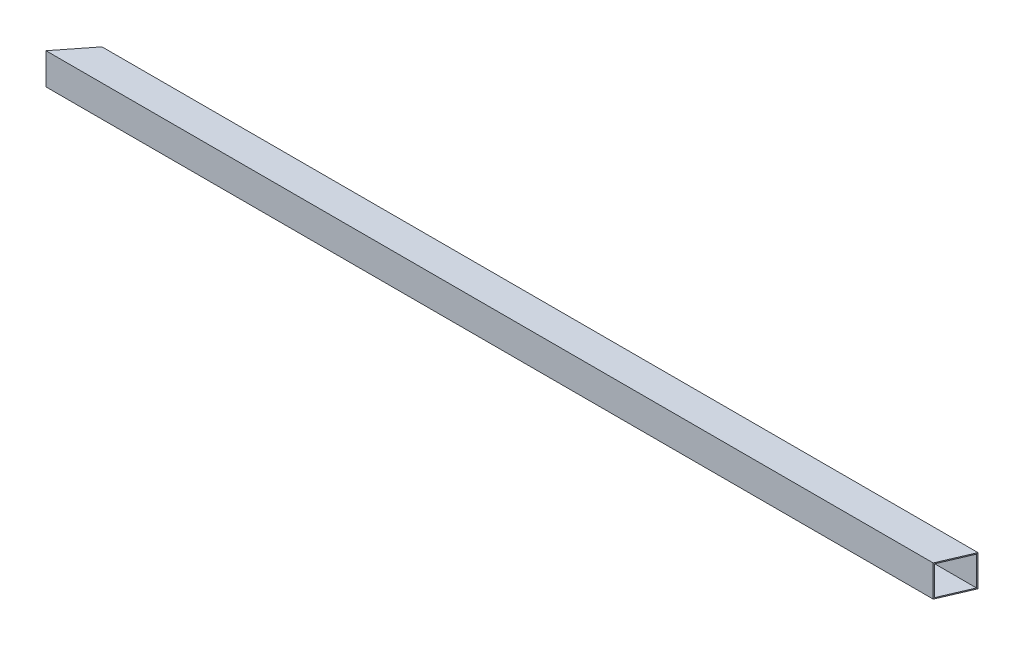
ISO-10303-21;
HEADER;
FILE_DESCRIPTION(('STEP AP214'),'2;1');
FILE_NAME('part.step','',(''),(''),'','','');
FILE_SCHEMA(('AUTOMOTIVE_DESIGN { 1 0 10303 214 1 1 1 1 }'));
ENDSEC;
DATA;
#1=APPLICATION_CONTEXT('core data for automotive mechanical design processes');
#2=APPLICATION_PROTOCOL_DEFINITION('international standard','automotive_design',2000,#1);
#3=PRODUCT_CONTEXT('',#1,'mechanical');
#4=PRODUCT('Part','Part','',(#3));
#5=PRODUCT_RELATED_PRODUCT_CATEGORY('part','',(#4));
#6=PRODUCT_DEFINITION_FORMATION('','',#4);
#7=PRODUCT_DEFINITION_CONTEXT('part definition',#1,'design');
#8=PRODUCT_DEFINITION('design','',#6,#7);
#9=PRODUCT_DEFINITION_SHAPE('','',#8);
#10=(LENGTH_UNIT() NAMED_UNIT(*) SI_UNIT(.MILLI.,.METRE.));
#11=(NAMED_UNIT(*) PLANE_ANGLE_UNIT() SI_UNIT($,.RADIAN.));
#12=(NAMED_UNIT(*) SI_UNIT($,.STERADIAN.) SOLID_ANGLE_UNIT());
#13=UNCERTAINTY_MEASURE_WITH_UNIT(LENGTH_MEASURE(1.E-05),#10,'distance_accuracy_value','');
#14=(GEOMETRIC_REPRESENTATION_CONTEXT(3) GLOBAL_UNCERTAINTY_ASSIGNED_CONTEXT((#13)) GLOBAL_UNIT_ASSIGNED_CONTEXT((#10,
#11,#12)) REPRESENTATION_CONTEXT('',''));
#15=CARTESIAN_POINT('',(0.,0.,0.));
#16=DIRECTION('',(0.,0.,1.));
#17=DIRECTION('',(1.,0.,0.));
#18=AXIS2_PLACEMENT_3D('',#15,#16,#17);
#19=CARTESIAN_POINT('',(-300.,56.,56.));
#20=DIRECTION('',(0.,0.,-1.));
#21=DIRECTION('',(0.,-1.,0.));
#22=AXIS2_PLACEMENT_3D('',#19,#20,#21);
#23=PLANE('',#22);
#24=DIRECTION('',(0.,-1.,0.));
#25=VECTOR('',#24,1.);
#26=CARTESIAN_POINT('',(-44.01941117419,-9084.5,55.999999999998));
#27=LINE('',#26,#25);
#28=CARTESIAN_POINT('',(-44.01941117419,56.,56.));
#29=VERTEX_POINT('',#28);
#30=CARTESIAN_POINT('',(-44.01941117419,-56.,56.));
#31=VERTEX_POINT('',#30);
#32=EDGE_CURVE('E114',#29,#31,#27,.T.);
#33=ORIENTED_EDGE('',*,*,#32,.F.);
#34=DIRECTION('',(1.,0.,0.));
#35=VECTOR('',#34,1.);
#36=CARTESIAN_POINT('',(-300.,56.,56.));
#37=LINE('',#36,#35);
#38=CARTESIAN_POINT('',(3349.87446722,56.,56.));
#39=VERTEX_POINT('',#38);
#40=EDGE_CURVE('E11',#29,#39,#37,.T.);
#41=ORIENTED_EDGE('',*,*,#40,.T.);
#42=DIRECTION('',(0.,1.,0.));
#43=VECTOR('',#42,1.);
#44=CARTESIAN_POINT('',(3349.87446722,915.5,56.));
#45=LINE('',#44,#43);
#46=CARTESIAN_POINT('',(3349.87446722,-56.,56.));
#47=VERTEX_POINT('',#46);
#48=EDGE_CURVE('E143',#47,#39,#45,.T.);
#49=ORIENTED_EDGE('',*,*,#48,.F.);
#50=DIRECTION('',(1.,0.,0.));
#51=VECTOR('',#50,1.);
#52=CARTESIAN_POINT('',(-300.,-56.,56.));
#53=LINE('',#52,#51);
#54=EDGE_CURVE('E74',#31,#47,#53,.T.);
#55=ORIENTED_EDGE('',*,*,#54,.F.);
#56=EDGE_LOOP('',(#33,#41,#49,#55));
#57=FACE_BOUND('',#56,.T.);
#58=ADVANCED_FACE('F17',(#57),#23,.T.);
#59=CARTESIAN_POINT('',(-300.,56.,-56.));
#60=DIRECTION('',(0.,-1.,0.));
#61=DIRECTION('',(-1.,0.,0.));
#62=AXIS2_PLACEMENT_3D('',#59,#60,#61);
#63=PLANE('',#62);
#64=DIRECTION('',(-0.617990032297072,0.,0.786185932195091));
#65=VECTOR('',#64,1.);
#66=CARTESIAN_POINT('',(-5903.773291313,56.000000000001,7510.579889522));
#67=LINE('',#66,#65);
#68=CARTESIAN_POINT('',(44.019411174196,56.,-56.));
#69=VERTEX_POINT('',#68);
#70=EDGE_CURVE('E109',#69,#29,#67,.T.);
#71=ORIENTED_EDGE('',*,*,#70,.F.);
#72=DIRECTION('',(1.,0.,0.));
#73=VECTOR('',#72,1.);
#74=CARTESIAN_POINT('',(-300.,56.,-56.));
#75=LINE('',#74,#73);
#76=CARTESIAN_POINT('',(3397.807181459,56.,-56.));
#77=VERTEX_POINT('',#76);
#78=EDGE_CURVE('E26',#69,#77,#75,.T.);
#79=ORIENTED_EDGE('',*,*,#78,.T.);
#80=DIRECTION('',(0.393452640342015,0.,-0.919344886214035));
#81=VECTOR('',#80,1.);
#82=CARTESIAN_POINT('',(2875.818806011,56.,1163.682610885));
#83=LINE('',#82,#81);
#84=EDGE_CURVE('E147',#39,#77,#83,.T.);
#85=ORIENTED_EDGE('',*,*,#84,.F.);
#86=ORIENTED_EDGE('',*,*,#40,.F.);
#87=EDGE_LOOP('',(#71,#79,#85,#86));
#88=FACE_BOUND('',#87,.T.);
#89=ADVANCED_FACE('F110',(#88),#63,.T.);
#90=CARTESIAN_POINT('',(-300.,-56.,-56.));
#91=DIRECTION('',(0.,0.,1.));
#92=DIRECTION('',(0.,-1.,0.));
#93=AXIS2_PLACEMENT_3D('',#90,#91,#92);
#94=PLANE('',#93);
#95=DIRECTION('',(0.,1.,0.));
#96=VECTOR('',#95,1.);
#97=CARTESIAN_POINT('',(44.019411174198,-9140.5,-56.));
#98=LINE('',#97,#96);
#99=CARTESIAN_POINT('',(44.019411174196,-56.,-56.));
#100=VERTEX_POINT('',#99);
#101=EDGE_CURVE('E102',#100,#69,#98,.T.);
#102=ORIENTED_EDGE('',*,*,#101,.F.);
#103=DIRECTION('',(1.,0.,0.));
#104=VECTOR('',#103,1.);
#105=CARTESIAN_POINT('',(-300.,-56.,-56.));
#106=LINE('',#105,#104);
#107=CARTESIAN_POINT('',(3397.807181459,-56.,-56.));
#108=VERTEX_POINT('',#107);
#109=EDGE_CURVE('E38',#100,#108,#106,.T.);
#110=ORIENTED_EDGE('',*,*,#109,.T.);
#111=DIRECTION('',(0.,-1.,0.));
#112=VECTOR('',#111,1.);
#113=CARTESIAN_POINT('',(3397.807181459,859.5,-56.));
#114=LINE('',#113,#112);
#115=EDGE_CURVE('E104',#77,#108,#114,.T.);
#116=ORIENTED_EDGE('',*,*,#115,.F.);
#117=ORIENTED_EDGE('',*,*,#78,.F.);
#118=EDGE_LOOP('',(#102,#110,#116,#117));
#119=FACE_BOUND('',#118,.T.);
#120=ADVANCED_FACE('F100',(#119),#94,.T.);
#121=CARTESIAN_POINT('',(-300.,-56.,56.));
#122=DIRECTION('',(0.,1.,0.));
#123=DIRECTION('',(0.,0.,-1.));
#124=AXIS2_PLACEMENT_3D('',#121,#122,#123);
#125=PLANE('',#124);
#126=DIRECTION('',(0.617990032297072,0.,-0.786185932195091));
#127=VECTOR('',#126,1.);
#128=CARTESIAN_POINT('',(-5930.981175212,-55.99999999999,7545.192835441));
#129=LINE('',#128,#127);
#130=EDGE_CURVE('E118',#31,#100,#129,.T.);
#131=ORIENTED_EDGE('',*,*,#130,.F.);
#132=ORIENTED_EDGE('',*,*,#54,.T.);
#133=DIRECTION('',(-0.393452640342015,0.,0.919344886214035));
#134=VECTOR('',#133,1.);
#135=CARTESIAN_POINT('',(2855.562560331,-56.,1211.013531995));
#136=LINE('',#135,#134);
#137=EDGE_CURVE('E174',#108,#47,#136,.T.);
#138=ORIENTED_EDGE('',*,*,#137,.F.);
#139=ORIENTED_EDGE('',*,*,#109,.F.);
#140=EDGE_LOOP('',(#131,#132,#138,#139));
#141=FACE_BOUND('',#140,.T.);
#142=ADVANCED_FACE('F236',(#141),#125,.T.);
#143=CARTESIAN_POINT('',(-300.,60.,60.));
#144=DIRECTION('',(0.,0.,-1.));
#145=DIRECTION('',(0.,-1.,0.));
#146=AXIS2_PLACEMENT_3D('',#143,#144,#145);
#147=PLANE('',#146);
#148=DIRECTION('',(1.,0.,0.));
#149=VECTOR('',#148,1.);
#150=CARTESIAN_POINT('',(-300.,-60.,60.));
#151=LINE('',#150,#149);
#152=CARTESIAN_POINT('',(-47.16365482949,-60.,60.));
#153=VERTEX_POINT('',#152);
#154=CARTESIAN_POINT('',(3348.162584569,-60.,60.));
#155=VERTEX_POINT('',#154);
#156=EDGE_CURVE('E177',#153,#155,#151,.T.);
#157=ORIENTED_EDGE('',*,*,#156,.T.);
#158=DIRECTION('',(0.,1.,0.));
#159=VECTOR('',#158,1.);
#160=CARTESIAN_POINT('',(3348.162584569,917.5,60.));
#161=LINE('',#160,#159);
#162=CARTESIAN_POINT('',(3348.162584569,60.,60.));
#163=VERTEX_POINT('',#162);
#164=EDGE_CURVE('E155',#155,#163,#161,.T.);
#165=ORIENTED_EDGE('',*,*,#164,.T.);
#166=DIRECTION('',(1.,0.,0.));
#167=VECTOR('',#166,1.);
#168=CARTESIAN_POINT('',(-300.,60.,60.));
#169=LINE('',#168,#167);
#170=CARTESIAN_POINT('',(-47.16365482949,60.,60.));
#171=VERTEX_POINT('',#170);
#172=EDGE_CURVE('E156',#171,#163,#169,.T.);
#173=ORIENTED_EDGE('',*,*,#172,.F.);
#174=DIRECTION('',(0.,-1.,0.));
#175=VECTOR('',#174,1.);
#176=CARTESIAN_POINT('',(-47.16365482949,-9082.5,59.999999999999));
#177=LINE('',#176,#175);
#178=EDGE_CURVE('E139',#171,#153,#177,.T.);
#179=ORIENTED_EDGE('',*,*,#178,.T.);
#180=EDGE_LOOP('',(#157,#165,#173,#179));
#181=FACE_BOUND('',#180,.T.);
#182=ADVANCED_FACE('F227',(#181),#147,.F.);
#183=CARTESIAN_POINT('',(-300.,-60.,60.));
#184=DIRECTION('',(0.,1.,0.));
#185=DIRECTION('',(0.,0.,-1.));
#186=AXIS2_PLACEMENT_3D('',#183,#184,#185);
#187=PLANE('',#186);
#188=DIRECTION('',(1.,0.,0.));
#189=VECTOR('',#188,1.);
#190=CARTESIAN_POINT('',(-300.,-60.,-60.));
#191=LINE('',#190,#189);
#192=CARTESIAN_POINT('',(47.163654829495,-60.,-60.));
#193=VERTEX_POINT('',#192);
#194=CARTESIAN_POINT('',(3399.519064111,-60.,-60.));
#195=VERTEX_POINT('',#194);
#196=EDGE_CURVE('E132',#193,#195,#191,.T.);
#197=ORIENTED_EDGE('',*,*,#196,.T.);
#198=DIRECTION('',(-0.393452640342015,0.,0.919344886214035));
#199=VECTOR('',#198,1.);
#200=CARTESIAN_POINT('',(2854.839122985,-60.,1212.703922034));
#201=LINE('',#200,#199);
#202=EDGE_CURVE('E148',#195,#155,#201,.T.);
#203=ORIENTED_EDGE('',*,*,#202,.T.);
#204=ORIENTED_EDGE('',*,*,#156,.F.);
#205=DIRECTION('',(0.617990032297072,0.,-0.786185932195091));
#206=VECTOR('',#205,1.);
#207=CARTESIAN_POINT('',(-5931.952885352,-59.99999999999,7546.429012081));
#208=LINE('',#207,#206);
#209=EDGE_CURVE('E120',#153,#193,#208,.T.);
#210=ORIENTED_EDGE('',*,*,#209,.T.);
#211=EDGE_LOOP('',(#197,#203,#204,#210));
#212=FACE_BOUND('',#211,.T.);
#213=ADVANCED_FACE('F219',(#212),#187,.F.);
#214=CARTESIAN_POINT('',(2926.269398042,1775.,1045.799315581));
#215=DIRECTION('',(-0.919344886214035,0.,-0.393452640342015));
#216=DIRECTION('',(-0.393452640342015,0.,0.919344886214035));
#217=AXIS2_PLACEMENT_3D('',#214,#215,#216);
#218=PLANE('',#217);
#219=ORIENTED_EDGE('',*,*,#48,.T.);
#220=ORIENTED_EDGE('',*,*,#84,.T.);
#221=ORIENTED_EDGE('',*,*,#115,.T.);
#222=ORIENTED_EDGE('',*,*,#137,.T.);
#223=EDGE_LOOP('',(#219,#220,#221,#222));
#224=FACE_BOUND('',#223,.T.);
#225=ORIENTED_EDGE('',*,*,#164,.F.);
#226=ORIENTED_EDGE('',*,*,#202,.F.);
#227=DIRECTION('',(0.,-1.,0.));
#228=VECTOR('',#227,1.);
#229=CARTESIAN_POINT('',(3399.519064111,857.5,-60.));
#230=LINE('',#229,#228);
#231=CARTESIAN_POINT('',(3399.519064111,60.,-60.));
#232=VERTEX_POINT('',#231);
#233=EDGE_CURVE('E130',#232,#195,#230,.T.);
#234=ORIENTED_EDGE('',*,*,#233,.F.);
#235=DIRECTION('',(0.393452640342015,0.,-0.919344886214035));
#236=VECTOR('',#235,1.);
#237=CARTESIAN_POINT('',(2876.542243357,60.,1161.992220846));
#238=LINE('',#237,#236);
#239=EDGE_CURVE('E152',#163,#232,#238,.T.);
#240=ORIENTED_EDGE('',*,*,#239,.F.);
#241=EDGE_LOOP('',(#225,#226,#234,#240));
#242=FACE_BOUND('',#241,.T.);
#243=ADVANCED_FACE('F210',(#224,#242),#218,.F.);
#244=CARTESIAN_POINT('',(-300.,60.,-60.));
#245=DIRECTION('',(0.,-1.,0.));
#246=DIRECTION('',(-1.,0.,0.));
#247=AXIS2_PLACEMENT_3D('',#244,#245,#246);
#248=PLANE('',#247);
#249=ORIENTED_EDGE('',*,*,#172,.T.);
#250=ORIENTED_EDGE('',*,*,#239,.T.);
#251=DIRECTION('',(1.,0.,0.));
#252=VECTOR('',#251,1.);
#253=CARTESIAN_POINT('',(-300.,60.,-60.));
#254=LINE('',#253,#252);
#255=CARTESIAN_POINT('',(47.163654829495,60.,-60.));
#256=VERTEX_POINT('',#255);
#257=EDGE_CURVE('E272',#256,#232,#254,.T.);
#258=ORIENTED_EDGE('',*,*,#257,.F.);
#259=DIRECTION('',(-0.617990032297072,0.,0.786185932195091));
#260=VECTOR('',#259,1.);
#261=CARTESIAN_POINT('',(-5902.801581174,60.000000000001,7509.343712883));
#262=LINE('',#261,#260);
#263=EDGE_CURVE('E126',#256,#171,#262,.T.);
#264=ORIENTED_EDGE('',*,*,#263,.T.);
#265=EDGE_LOOP('',(#249,#250,#258,#264));
#266=FACE_BOUND('',#265,.T.);
#267=ADVANCED_FACE('F204',(#266),#248,.F.);
#268=CARTESIAN_POINT('',(-11720.18096252,-18225.,14910.01620408));
#269=DIRECTION('',(0.786185932195091,0.,0.617990032297072));
#270=DIRECTION('',(0.,-1.,0.));
#271=AXIS2_PLACEMENT_3D('',#268,#269,#270);
#272=PLANE('',#271);
#273=ORIENTED_EDGE('',*,*,#101,.T.);
#274=ORIENTED_EDGE('',*,*,#70,.T.);
#275=ORIENTED_EDGE('',*,*,#32,.T.);
#276=ORIENTED_EDGE('',*,*,#130,.T.);
#277=EDGE_LOOP('',(#273,#274,#275,#276));
#278=FACE_BOUND('',#277,.T.);
#279=ORIENTED_EDGE('',*,*,#178,.F.);
#280=ORIENTED_EDGE('',*,*,#263,.F.);
#281=DIRECTION('',(0.,1.,0.));
#282=VECTOR('',#281,1.);
#283=CARTESIAN_POINT('',(47.163654829497,-9142.5,-60.));
#284=LINE('',#283,#282);
#285=EDGE_CURVE('E135',#193,#256,#284,.T.);
#286=ORIENTED_EDGE('',*,*,#285,.F.);
#287=ORIENTED_EDGE('',*,*,#209,.F.);
#288=EDGE_LOOP('',(#279,#280,#286,#287));
#289=FACE_BOUND('',#288,.T.);
#290=ADVANCED_FACE('F116',(#278,#289),#272,.F.);
#291=CARTESIAN_POINT('',(-300.,-60.,-60.));
#292=DIRECTION('',(0.,0.,1.));
#293=DIRECTION('',(0.,-1.,0.));
#294=AXIS2_PLACEMENT_3D('',#291,#292,#293);
#295=PLANE('',#294);
#296=ORIENTED_EDGE('',*,*,#257,.T.);
#297=ORIENTED_EDGE('',*,*,#233,.T.);
#298=ORIENTED_EDGE('',*,*,#196,.F.);
#299=ORIENTED_EDGE('',*,*,#285,.T.);
#300=EDGE_LOOP('',(#296,#297,#298,#299));
#301=FACE_BOUND('',#300,.T.);
#302=ADVANCED_FACE('F190',(#301),#295,.F.);
#303=CLOSED_SHELL('',(#58,#89,#120,#142,#182,#213,#243,#267,#290,#302));
#304=MANIFOLD_SOLID_BREP('B1',#303);
#305=ADVANCED_BREP_SHAPE_REPRESENTATION('',(#18,#304),#14);
#306=SHAPE_DEFINITION_REPRESENTATION(#9,#305);
ENDSEC;
END-ISO-10303-21;
